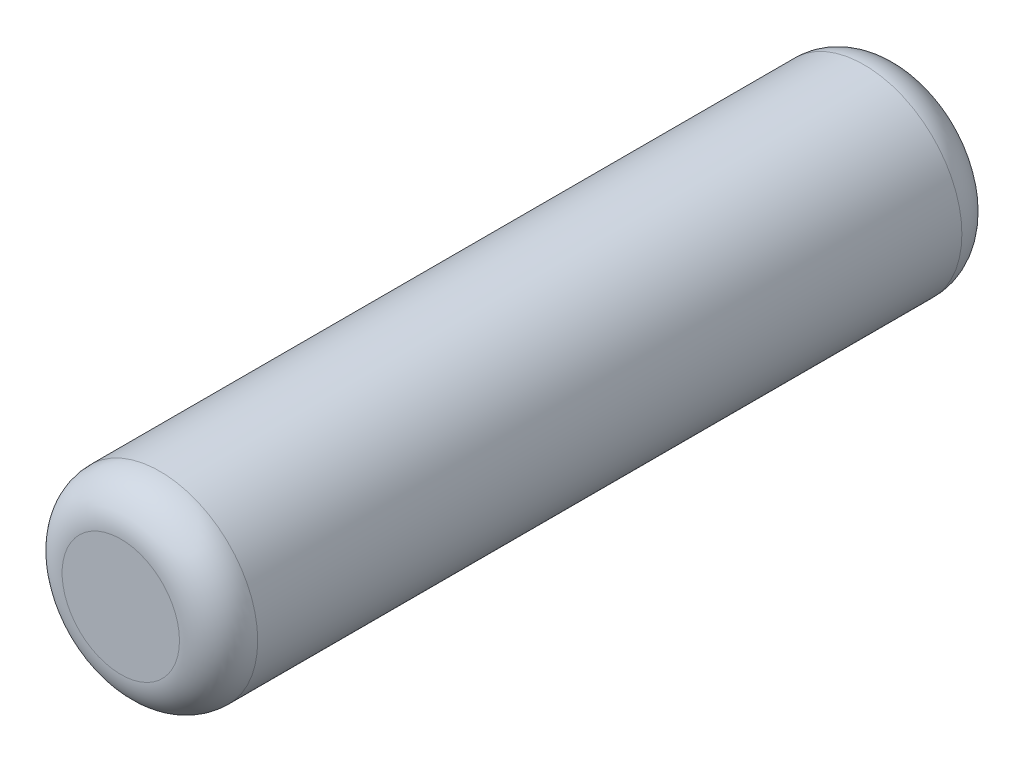
ISO-10303-21;
HEADER;
FILE_DESCRIPTION(('STEP AP214'),'2;1');
FILE_NAME('part.step','',(''),(''),'','','');
FILE_SCHEMA(('AUTOMOTIVE_DESIGN { 1 0 10303 214 1 1 1 1 }'));
ENDSEC;
DATA;
#1=APPLICATION_CONTEXT('core data for automotive mechanical design processes');
#2=APPLICATION_PROTOCOL_DEFINITION('international standard','automotive_design',2000,#1);
#3=PRODUCT_CONTEXT('',#1,'mechanical');
#4=PRODUCT('Part','Part','',(#3));
#5=PRODUCT_RELATED_PRODUCT_CATEGORY('part','',(#4));
#6=PRODUCT_DEFINITION_FORMATION('','',#4);
#7=PRODUCT_DEFINITION_CONTEXT('part definition',#1,'design');
#8=PRODUCT_DEFINITION('design','',#6,#7);
#9=PRODUCT_DEFINITION_SHAPE('','',#8);
#10=(LENGTH_UNIT() NAMED_UNIT(*) SI_UNIT(.MILLI.,.METRE.));
#11=(NAMED_UNIT(*) PLANE_ANGLE_UNIT() SI_UNIT($,.RADIAN.));
#12=(NAMED_UNIT(*) SI_UNIT($,.STERADIAN.) SOLID_ANGLE_UNIT());
#13=UNCERTAINTY_MEASURE_WITH_UNIT(LENGTH_MEASURE(1.E-05),#10,'distance_accuracy_value','');
#14=(GEOMETRIC_REPRESENTATION_CONTEXT(3) GLOBAL_UNCERTAINTY_ASSIGNED_CONTEXT((#13)) GLOBAL_UNIT_ASSIGNED_CONTEXT((#10,
#11,#12)) REPRESENTATION_CONTEXT('',''));
#15=CARTESIAN_POINT('',(0.,0.,0.));
#16=DIRECTION('',(0.,0.,1.));
#17=DIRECTION('',(1.,0.,0.));
#18=AXIS2_PLACEMENT_3D('',#15,#16,#17);
#19=CARTESIAN_POINT('',(0.,0.,20.));
#20=DIRECTION('',(0.,0.,-1.));
#21=DIRECTION('',(-1.,0.,0.));
#22=AXIS2_PLACEMENT_3D('',#19,#20,#21);
#23=CYLINDRICAL_SURFACE('',#22,2.5);
#24=CARTESIAN_POINT('',(0.,0.,1.));
#25=DIRECTION('',(0.,0.,1.));
#26=DIRECTION('',(1.,0.,0.));
#27=AXIS2_PLACEMENT_3D('',#24,#25,#26);
#28=CIRCLE('',#27,2.5);
#29=CARTESIAN_POINT('',(2.5,0.,1.));
#30=VERTEX_POINT('',#29);
#31=EDGE_CURVE('E39',#30,#30,#28,.T.);
#32=ORIENTED_EDGE('',*,*,#31,.T.);
#33=EDGE_LOOP('',(#32));
#34=FACE_BOUND('',#33,.T.);
#35=CARTESIAN_POINT('',(0.,0.,19.));
#36=DIRECTION('',(0.,0.,1.));
#37=DIRECTION('',(1.,0.,0.));
#38=AXIS2_PLACEMENT_3D('',#35,#36,#37);
#39=CIRCLE('',#38,2.5);
#40=CARTESIAN_POINT('',(2.5,0.,19.));
#41=VERTEX_POINT('',#40);
#42=EDGE_CURVE('E43',#41,#41,#39,.F.);
#43=ORIENTED_EDGE('',*,*,#42,.T.);
#44=EDGE_LOOP('',(#43));
#45=FACE_BOUND('',#44,.T.);
#46=ADVANCED_FACE('F29',(#34,#45),#23,.T.);
#47=CARTESIAN_POINT('',(0.,0.,20.));
#48=DIRECTION('',(0.,0.,1.));
#49=DIRECTION('',(1.,0.,0.));
#50=AXIS2_PLACEMENT_3D('',#47,#48,#49);
#51=PLANE('',#50);
#52=CARTESIAN_POINT('',(0.,0.,20.));
#53=DIRECTION('',(0.,0.,1.));
#54=DIRECTION('',(1.,0.,0.));
#55=AXIS2_PLACEMENT_3D('',#52,#53,#54);
#56=CIRCLE('',#55,1.5);
#57=CARTESIAN_POINT('',(1.5,0.,20.));
#58=VERTEX_POINT('',#57);
#59=EDGE_CURVE('E10',#58,#58,#56,.T.);
#60=ORIENTED_EDGE('',*,*,#59,.T.);
#61=EDGE_LOOP('',(#60));
#62=FACE_BOUND('',#61,.T.);
#63=ADVANCED_FACE('F62',(#62),#51,.T.);
#64=CARTESIAN_POINT('',(0.,0.,0.));
#65=DIRECTION('',(0.,0.,1.));
#66=DIRECTION('',(1.,0.,0.));
#67=AXIS2_PLACEMENT_3D('',#64,#65,#66);
#68=PLANE('',#67);
#69=CARTESIAN_POINT('',(0.,0.,0.));
#70=DIRECTION('',(0.,0.,1.));
#71=DIRECTION('',(1.,0.,0.));
#72=AXIS2_PLACEMENT_3D('',#69,#70,#71);
#73=CIRCLE('',#72,1.5);
#74=CARTESIAN_POINT('',(1.5,0.,0.));
#75=VERTEX_POINT('',#74);
#76=EDGE_CURVE('E35',#75,#75,#73,.F.);
#77=ORIENTED_EDGE('',*,*,#76,.T.);
#78=EDGE_LOOP('',(#77));
#79=FACE_BOUND('',#78,.T.);
#80=ADVANCED_FACE('F58',(#79),#68,.F.);
#81=CARTESIAN_POINT('',(0.,0.,1.));
#82=DIRECTION('',(0.,0.,1.));
#83=DIRECTION('',(1.,0.,0.));
#84=AXIS2_PLACEMENT_3D('',#81,#82,#83);
#85=TOROIDAL_SURFACE('',#84,1.5,1.);
#86=ORIENTED_EDGE('',*,*,#76,.F.);
#87=EDGE_LOOP('',(#86));
#88=FACE_BOUND('',#87,.T.);
#89=ORIENTED_EDGE('',*,*,#31,.F.);
#90=EDGE_LOOP('',(#89));
#91=FACE_BOUND('',#90,.T.);
#92=ADVANCED_FACE('F53',(#88,#91),#85,.T.);
#93=CARTESIAN_POINT('',(0.,0.,19.));
#94=DIRECTION('',(0.,0.,1.));
#95=DIRECTION('',(1.,0.,0.));
#96=AXIS2_PLACEMENT_3D('',#93,#94,#95);
#97=TOROIDAL_SURFACE('',#96,1.5,1.);
#98=ORIENTED_EDGE('',*,*,#42,.F.);
#99=EDGE_LOOP('',(#98));
#100=FACE_BOUND('',#99,.T.);
#101=ORIENTED_EDGE('',*,*,#59,.F.);
#102=EDGE_LOOP('',(#101));
#103=FACE_BOUND('',#102,.T.);
#104=ADVANCED_FACE('F50',(#100,#103),#97,.T.);
#105=CLOSED_SHELL('',(#46,#63,#80,#92,#104));
#106=MANIFOLD_SOLID_BREP('B2',#105);
#107=ADVANCED_BREP_SHAPE_REPRESENTATION('',(#18,#106),#14);
#108=SHAPE_DEFINITION_REPRESENTATION(#9,#107);
ENDSEC;
END-ISO-10303-21;
